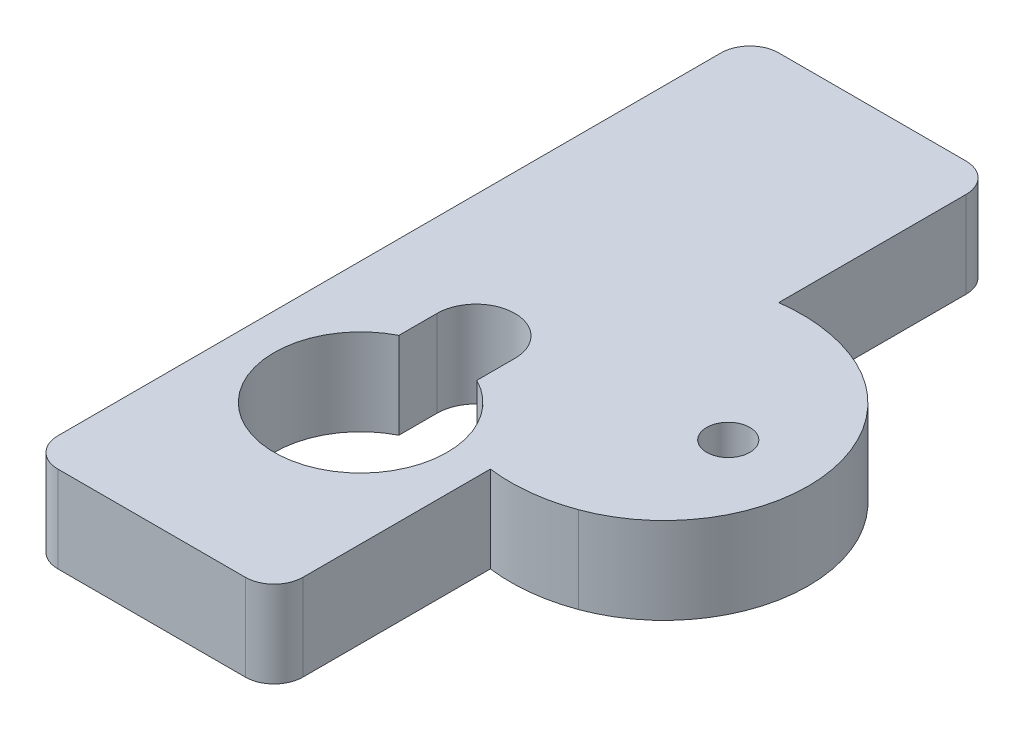
ISO-10303-21;
HEADER;
FILE_DESCRIPTION(('STEP AP214'),'2;1');
FILE_NAME('part.step','',(''),(''),'','','');
FILE_SCHEMA(('AUTOMOTIVE_DESIGN { 1 0 10303 214 1 1 1 1 }'));
ENDSEC;
DATA;
#1=APPLICATION_CONTEXT('core data for automotive mechanical design processes');
#2=APPLICATION_PROTOCOL_DEFINITION('international standard','automotive_design',2000,#1);
#3=PRODUCT_CONTEXT('',#1,'mechanical');
#4=PRODUCT('Part','Part','',(#3));
#5=PRODUCT_RELATED_PRODUCT_CATEGORY('part','',(#4));
#6=PRODUCT_DEFINITION_FORMATION('','',#4);
#7=PRODUCT_DEFINITION_CONTEXT('part definition',#1,'design');
#8=PRODUCT_DEFINITION('design','',#6,#7);
#9=PRODUCT_DEFINITION_SHAPE('','',#8);
#10=(LENGTH_UNIT() NAMED_UNIT(*) SI_UNIT(.MILLI.,.METRE.));
#11=(NAMED_UNIT(*) PLANE_ANGLE_UNIT() SI_UNIT($,.RADIAN.));
#12=(NAMED_UNIT(*) SI_UNIT($,.STERADIAN.) SOLID_ANGLE_UNIT());
#13=UNCERTAINTY_MEASURE_WITH_UNIT(LENGTH_MEASURE(1.E-05),#10,'distance_accuracy_value','');
#14=(GEOMETRIC_REPRESENTATION_CONTEXT(3) GLOBAL_UNCERTAINTY_ASSIGNED_CONTEXT((#13)) GLOBAL_UNIT_ASSIGNED_CONTEXT((#10,
#11,#12)) REPRESENTATION_CONTEXT('',''));
#15=CARTESIAN_POINT('',(0.,0.,0.));
#16=DIRECTION('',(0.,0.,1.));
#17=DIRECTION('',(1.,0.,0.));
#18=AXIS2_PLACEMENT_3D('',#15,#16,#17);
#19=CARTESIAN_POINT('',(5.79813436692227,6.,0.));
#20=DIRECTION('',(1.,0.,0.));
#21=DIRECTION('',(0.,0.,-1.));
#22=AXIS2_PLACEMENT_3D('',#19,#20,#21);
#23=PLANE('',#22);
#24=DIRECTION('',(0.,0.,1.));
#25=VECTOR('',#24,1.);
#26=CARTESIAN_POINT('',(5.79813436692227,0.,0.));
#27=LINE('',#26,#25);
#28=CARTESIAN_POINT('',(5.79813436692227,0.,-22.5));
#29=VERTEX_POINT('',#28);
#30=CARTESIAN_POINT('',(5.79813436692227,0.,-19.8572308239233));
#31=VERTEX_POINT('',#30);
#32=EDGE_CURVE('E225',#29,#31,#27,.T.);
#33=ORIENTED_EDGE('',*,*,#32,.F.);
#34=DIRECTION('',(0.,-1.,0.));
#35=VECTOR('',#34,1.);
#36=CARTESIAN_POINT('',(5.79813436692227,6.,-22.5));
#37=LINE('',#36,#35);
#38=CARTESIAN_POINT('',(5.79813436692227,6.,-22.5));
#39=VERTEX_POINT('',#38);
#40=EDGE_CURVE('E244',#39,#29,#37,.T.);
#41=ORIENTED_EDGE('',*,*,#40,.F.);
#42=DIRECTION('',(0.,0.,1.));
#43=VECTOR('',#42,1.);
#44=CARTESIAN_POINT('',(5.79813436692227,6.,0.));
#45=LINE('',#44,#43);
#46=CARTESIAN_POINT('',(5.79813436692227,6.,-19.8572308239233));
#47=VERTEX_POINT('',#46);
#48=EDGE_CURVE('E194',#39,#47,#45,.T.);
#49=ORIENTED_EDGE('',*,*,#48,.T.);
#50=DIRECTION('',(0.,-1.,0.));
#51=VECTOR('',#50,1.);
#52=CARTESIAN_POINT('',(5.79813436692227,6.,-19.8572308239233));
#53=LINE('',#52,#51);
#54=EDGE_CURVE('E172',#47,#31,#53,.T.);
#55=ORIENTED_EDGE('',*,*,#54,.T.);
#56=EDGE_LOOP('',(#33,#41,#49,#55));
#57=FACE_BOUND('',#56,.T.);
#58=ADVANCED_FACE('F41',(#57),#23,.T.);
#59=CARTESIAN_POINT('',(8.5,6.,-22.5));
#60=DIRECTION('',(0.,-1.,0.));
#61=DIRECTION('',(0.,0.,-1.));
#62=AXIS2_PLACEMENT_3D('',#59,#60,#61);
#63=CYLINDRICAL_SURFACE('',#62,2.70186563307773);
#64=CARTESIAN_POINT('',(8.5,0.,-22.5));
#65=DIRECTION('',(0.,1.,0.));
#66=DIRECTION('',(0.,0.,1.));
#67=AXIS2_PLACEMENT_3D('',#64,#65,#66);
#68=CIRCLE('',#67,2.70186563307773);
#69=CARTESIAN_POINT('',(11.2018656330777,0.,-22.5));
#70=VERTEX_POINT('',#69);
#71=EDGE_CURVE('E228',#70,#29,#68,.T.);
#72=ORIENTED_EDGE('',*,*,#71,.F.);
#73=DIRECTION('',(0.,-1.,0.));
#74=VECTOR('',#73,1.);
#75=CARTESIAN_POINT('',(11.2018656330777,6.,-22.5));
#76=LINE('',#75,#74);
#77=CARTESIAN_POINT('',(11.2018656330777,6.,-22.5));
#78=VERTEX_POINT('',#77);
#79=EDGE_CURVE('E242',#78,#70,#76,.T.);
#80=ORIENTED_EDGE('',*,*,#79,.F.);
#81=CARTESIAN_POINT('',(8.5,6.,-22.5));
#82=DIRECTION('',(0.,1.,0.));
#83=DIRECTION('',(0.,0.,1.));
#84=AXIS2_PLACEMENT_3D('',#81,#82,#83);
#85=CIRCLE('',#84,2.70186563307773);
#86=EDGE_CURVE('E197',#78,#39,#85,.T.);
#87=ORIENTED_EDGE('',*,*,#86,.T.);
#88=ORIENTED_EDGE('',*,*,#40,.T.);
#89=EDGE_LOOP('',(#72,#80,#87,#88));
#90=FACE_BOUND('',#89,.T.);
#91=ADVANCED_FACE('F330',(#90),#63,.F.);
#92=CARTESIAN_POINT('',(11.2018656330777,6.,0.));
#93=DIRECTION('',(1.,0.,0.));
#94=DIRECTION('',(0.,0.,-1.));
#95=AXIS2_PLACEMENT_3D('',#92,#93,#94);
#96=PLANE('',#95);
#97=DIRECTION('',(0.,0.,1.));
#98=VECTOR('',#97,1.);
#99=CARTESIAN_POINT('',(11.2018656330777,0.,0.));
#100=LINE('',#99,#98);
#101=CARTESIAN_POINT('',(11.2018656330777,0.,-19.8572308239233));
#102=VERTEX_POINT('',#101);
#103=EDGE_CURVE('E231',#70,#102,#100,.T.);
#104=ORIENTED_EDGE('',*,*,#103,.T.);
#105=DIRECTION('',(0.,-1.,0.));
#106=VECTOR('',#105,1.);
#107=CARTESIAN_POINT('',(11.2018656330777,6.,-19.8572308239233));
#108=LINE('',#107,#106);
#109=CARTESIAN_POINT('',(11.2018656330777,6.,-19.8572308239233));
#110=VERTEX_POINT('',#109);
#111=EDGE_CURVE('E240',#110,#102,#108,.T.);
#112=ORIENTED_EDGE('',*,*,#111,.F.);
#113=DIRECTION('',(0.,0.,1.));
#114=VECTOR('',#113,1.);
#115=CARTESIAN_POINT('',(11.2018656330777,6.,0.));
#116=LINE('',#115,#114);
#117=EDGE_CURVE('E200',#78,#110,#116,.T.);
#118=ORIENTED_EDGE('',*,*,#117,.F.);
#119=ORIENTED_EDGE('',*,*,#79,.T.);
#120=EDGE_LOOP('',(#104,#112,#118,#119));
#121=FACE_BOUND('',#120,.T.);
#122=ADVANCED_FACE('F336',(#121),#96,.F.);
#123=CARTESIAN_POINT('',(18.5,6.,-26.5));
#124=DIRECTION('',(0.,-1.,0.));
#125=DIRECTION('',(0.,0.,-1.));
#126=AXIS2_PLACEMENT_3D('',#123,#124,#125);
#127=CYLINDRICAL_SURFACE('',#126,11.5974135047432);
#128=CARTESIAN_POINT('',(18.5,0.,-26.5));
#129=DIRECTION('',(0.,1.,0.));
#130=DIRECTION('',(0.,0.,1.));
#131=AXIS2_PLACEMENT_3D('',#128,#129,#130);
#132=CIRCLE('',#131,11.5974135047432);
#133=CARTESIAN_POINT('',(22.487979972059,0.,-15.609820215329));
#134=VERTEX_POINT('',#133);
#135=CARTESIAN_POINT('',(17.,0.,-15.));
#136=VERTEX_POINT('',#135);
#137=EDGE_CURVE('E208',#134,#136,#132,.F.);
#138=ORIENTED_EDGE('',*,*,#137,.F.);
#139=DIRECTION('',(0.,-1.,0.));
#140=VECTOR('',#139,1.);
#141=CARTESIAN_POINT('',(22.487979972059,6.,-15.609820215329));
#142=LINE('',#141,#140);
#143=CARTESIAN_POINT('',(22.487979972059,6.,-15.609820215329));
#144=VERTEX_POINT('',#143);
#145=EDGE_CURVE('E49',#134,#144,#142,.F.);
#146=ORIENTED_EDGE('',*,*,#145,.T.);
#147=CARTESIAN_POINT('',(18.5,6.,-26.5));
#148=DIRECTION('',(0.,1.,0.));
#149=DIRECTION('',(0.,0.,1.));
#150=AXIS2_PLACEMENT_3D('',#147,#148,#149);
#151=CIRCLE('',#150,11.5974135047432);
#152=CARTESIAN_POINT('',(17.,6.,-15.));
#153=VERTEX_POINT('',#152);
#154=EDGE_CURVE('E178',#144,#153,#151,.F.);
#155=ORIENTED_EDGE('',*,*,#154,.T.);
#156=DIRECTION('',(0.,-1.,0.));
#157=VECTOR('',#156,1.);
#158=CARTESIAN_POINT('',(17.,6.,-15.));
#159=LINE('',#158,#157);
#160=EDGE_CURVE('E173',#153,#136,#159,.T.);
#161=ORIENTED_EDGE('',*,*,#160,.T.);
#162=EDGE_LOOP('',(#138,#146,#155,#161));
#163=FACE_BOUND('',#162,.T.);
#164=ADVANCED_FACE('F323',(#163),#127,.T.);
#165=CARTESIAN_POINT('',(18.5,6.,-23.5));
#166=DIRECTION('',(0.,-1.,0.));
#167=DIRECTION('',(0.,0.,-1.));
#168=AXIS2_PLACEMENT_3D('',#165,#166,#167);
#169=CYLINDRICAL_SURFACE('',#168,11.5974135047432);
#170=CARTESIAN_POINT('',(18.5,6.,-23.5));
#171=DIRECTION('',(0.,1.,0.));
#172=DIRECTION('',(0.,0.,1.));
#173=AXIS2_PLACEMENT_3D('',#170,#171,#172);
#174=CIRCLE('',#173,11.5974135047432);
#175=CARTESIAN_POINT('',(17.,6.,-35.));
#176=VERTEX_POINT('',#175);
#177=CARTESIAN_POINT('',(22.487979972059,6.,-34.390179784671));
#178=VERTEX_POINT('',#177);
#179=EDGE_CURVE('E164',#176,#178,#174,.F.);
#180=ORIENTED_EDGE('',*,*,#179,.T.);
#181=DIRECTION('',(0.,-1.,0.));
#182=VECTOR('',#181,1.);
#183=CARTESIAN_POINT('',(22.487979972059,6.,-34.390179784671));
#184=LINE('',#183,#182);
#185=CARTESIAN_POINT('',(22.487979972059,0.,-34.390179784671));
#186=VERTEX_POINT('',#185);
#187=EDGE_CURVE('E283',#178,#186,#184,.T.);
#188=ORIENTED_EDGE('',*,*,#187,.T.);
#189=CARTESIAN_POINT('',(18.5,0.,-23.5));
#190=DIRECTION('',(0.,1.,0.));
#191=DIRECTION('',(0.,0.,1.));
#192=AXIS2_PLACEMENT_3D('',#189,#190,#191);
#193=CIRCLE('',#192,11.5974135047432);
#194=CARTESIAN_POINT('',(17.,0.,-35.));
#195=VERTEX_POINT('',#194);
#196=EDGE_CURVE('E171',#195,#186,#193,.F.);
#197=ORIENTED_EDGE('',*,*,#196,.F.);
#198=DIRECTION('',(0.,-1.,0.));
#199=VECTOR('',#198,1.);
#200=CARTESIAN_POINT('',(17.,6.,-35.));
#201=LINE('',#200,#199);
#202=EDGE_CURVE('E156',#176,#195,#201,.T.);
#203=ORIENTED_EDGE('',*,*,#202,.F.);
#204=EDGE_LOOP('',(#180,#188,#197,#203));
#205=FACE_BOUND('',#204,.T.);
#206=ADVANCED_FACE('F168',(#205),#169,.T.);
#207=CARTESIAN_POINT('',(17.,6.,0.));
#208=DIRECTION('',(1.,0.,0.));
#209=DIRECTION('',(0.,0.,-1.));
#210=AXIS2_PLACEMENT_3D('',#207,#208,#209);
#211=PLANE('',#210);
#212=DIRECTION('',(0.,0.,1.));
#213=VECTOR('',#212,1.);
#214=CARTESIAN_POINT('',(17.,0.,0.));
#215=LINE('',#214,#213);
#216=CARTESIAN_POINT('',(17.,0.,-48.));
#217=VERTEX_POINT('',#216);
#218=EDGE_CURVE('E211',#217,#195,#215,.T.);
#219=ORIENTED_EDGE('',*,*,#218,.F.);
#220=DIRECTION('',(0.,-1.,0.));
#221=VECTOR('',#220,1.);
#222=CARTESIAN_POINT('',(17.,6.,-48.));
#223=LINE('',#222,#221);
#224=CARTESIAN_POINT('',(17.,6.,-48.));
#225=VERTEX_POINT('',#224);
#226=EDGE_CURVE('E159',#217,#225,#223,.F.);
#227=ORIENTED_EDGE('',*,*,#226,.T.);
#228=DIRECTION('',(0.,0.,1.));
#229=VECTOR('',#228,1.);
#230=CARTESIAN_POINT('',(17.,6.,0.));
#231=LINE('',#230,#229);
#232=EDGE_CURVE('E152',#225,#176,#231,.T.);
#233=ORIENTED_EDGE('',*,*,#232,.T.);
#234=ORIENTED_EDGE('',*,*,#202,.T.);
#235=EDGE_LOOP('',(#219,#227,#233,#234));
#236=FACE_BOUND('',#235,.T.);
#237=ADVANCED_FACE('F155',(#236),#211,.T.);
#238=CARTESIAN_POINT('',(0.,6.,-50.));
#239=DIRECTION('',(0.,0.,-1.));
#240=DIRECTION('',(-1.,0.,0.));
#241=AXIS2_PLACEMENT_3D('',#238,#239,#240);
#242=PLANE('',#241);
#243=DIRECTION('',(1.,0.,0.));
#244=VECTOR('',#243,1.);
#245=CARTESIAN_POINT('',(0.,0.,-50.));
#246=LINE('',#245,#244);
#247=CARTESIAN_POINT('',(2.,0.,-50.));
#248=VERTEX_POINT('',#247);
#249=CARTESIAN_POINT('',(15.,0.,-50.));
#250=VERTEX_POINT('',#249);
#251=EDGE_CURVE('E213',#248,#250,#246,.T.);
#252=ORIENTED_EDGE('',*,*,#251,.F.);
#253=DIRECTION('',(0.,-1.,0.));
#254=VECTOR('',#253,1.);
#255=CARTESIAN_POINT('',(2.,6.,-50.));
#256=LINE('',#255,#254);
#257=CARTESIAN_POINT('',(2.,6.,-50.));
#258=VERTEX_POINT('',#257);
#259=EDGE_CURVE('E264',#248,#258,#256,.F.);
#260=ORIENTED_EDGE('',*,*,#259,.T.);
#261=DIRECTION('',(1.,0.,0.));
#262=VECTOR('',#261,1.);
#263=CARTESIAN_POINT('',(0.,6.,-50.));
#264=LINE('',#263,#262);
#265=CARTESIAN_POINT('',(15.,6.,-50.));
#266=VERTEX_POINT('',#265);
#267=EDGE_CURVE('E163',#258,#266,#264,.T.);
#268=ORIENTED_EDGE('',*,*,#267,.T.);
#269=DIRECTION('',(0.,-1.,0.));
#270=VECTOR('',#269,1.);
#271=CARTESIAN_POINT('',(15.,6.,-50.));
#272=LINE('',#271,#270);
#273=EDGE_CURVE('E261',#266,#250,#272,.T.);
#274=ORIENTED_EDGE('',*,*,#273,.T.);
#275=EDGE_LOOP('',(#252,#260,#268,#274));
#276=FACE_BOUND('',#275,.T.);
#277=ADVANCED_FACE('F295',(#276),#242,.T.);
#278=CARTESIAN_POINT('',(0.,6.,0.));
#279=DIRECTION('',(-1.,0.,0.));
#280=DIRECTION('',(0.,0.,1.));
#281=AXIS2_PLACEMENT_3D('',#278,#279,#280);
#282=PLANE('',#281);
#283=DIRECTION('',(0.,0.,-1.));
#284=VECTOR('',#283,1.);
#285=CARTESIAN_POINT('',(0.,6.,0.));
#286=LINE('',#285,#284);
#287=CARTESIAN_POINT('',(0.,6.,-2.));
#288=VERTEX_POINT('',#287);
#289=CARTESIAN_POINT('',(0.,6.,-48.));
#290=VERTEX_POINT('',#289);
#291=EDGE_CURVE('E185',#288,#290,#286,.T.);
#292=ORIENTED_EDGE('',*,*,#291,.T.);
#293=DIRECTION('',(0.,-1.,0.));
#294=VECTOR('',#293,1.);
#295=CARTESIAN_POINT('',(0.,6.,-48.));
#296=LINE('',#295,#294);
#297=CARTESIAN_POINT('',(0.,0.,-48.));
#298=VERTEX_POINT('',#297);
#299=EDGE_CURVE('E250',#290,#298,#296,.T.);
#300=ORIENTED_EDGE('',*,*,#299,.T.);
#301=DIRECTION('',(0.,0.,-1.));
#302=VECTOR('',#301,1.);
#303=CARTESIAN_POINT('',(0.,0.,0.));
#304=LINE('',#303,#302);
#305=CARTESIAN_POINT('',(0.,0.,-2.));
#306=VERTEX_POINT('',#305);
#307=EDGE_CURVE('E216',#306,#298,#304,.T.);
#308=ORIENTED_EDGE('',*,*,#307,.F.);
#309=DIRECTION('',(0.,-1.,0.));
#310=VECTOR('',#309,1.);
#311=CARTESIAN_POINT('',(0.,6.,-2.));
#312=LINE('',#311,#310);
#313=EDGE_CURVE('E246',#306,#288,#312,.F.);
#314=ORIENTED_EDGE('',*,*,#313,.T.);
#315=EDGE_LOOP('',(#292,#300,#308,#314));
#316=FACE_BOUND('',#315,.T.);
#317=ADVANCED_FACE('F303',(#316),#282,.T.);
#318=CARTESIAN_POINT('',(0.,6.,0.));
#319=DIRECTION('',(0.,0.,1.));
#320=DIRECTION('',(1.,0.,0.));
#321=AXIS2_PLACEMENT_3D('',#318,#319,#320);
#322=PLANE('',#321);
#323=DIRECTION('',(-1.,0.,0.));
#324=VECTOR('',#323,1.);
#325=CARTESIAN_POINT('',(0.,6.,0.));
#326=LINE('',#325,#324);
#327=CARTESIAN_POINT('',(15.,6.,0.));
#328=VERTEX_POINT('',#327);
#329=CARTESIAN_POINT('',(2.,6.,0.));
#330=VERTEX_POINT('',#329);
#331=EDGE_CURVE('E188',#328,#330,#326,.T.);
#332=ORIENTED_EDGE('',*,*,#331,.T.);
#333=DIRECTION('',(0.,-1.,0.));
#334=VECTOR('',#333,1.);
#335=CARTESIAN_POINT('',(2.,6.,0.));
#336=LINE('',#335,#334);
#337=CARTESIAN_POINT('',(2.,0.,0.));
#338=VERTEX_POINT('',#337);
#339=EDGE_CURVE('E277',#330,#338,#336,.T.);
#340=ORIENTED_EDGE('',*,*,#339,.T.);
#341=DIRECTION('',(-1.,0.,0.));
#342=VECTOR('',#341,1.);
#343=CARTESIAN_POINT('',(0.,0.,0.));
#344=LINE('',#343,#342);
#345=CARTESIAN_POINT('',(15.,0.,0.));
#346=VERTEX_POINT('',#345);
#347=EDGE_CURVE('E219',#346,#338,#344,.T.);
#348=ORIENTED_EDGE('',*,*,#347,.F.);
#349=DIRECTION('',(0.,-1.,0.));
#350=VECTOR('',#349,1.);
#351=CARTESIAN_POINT('',(15.,6.,0.));
#352=LINE('',#351,#350);
#353=EDGE_CURVE('E275',#346,#328,#352,.F.);
#354=ORIENTED_EDGE('',*,*,#353,.T.);
#355=EDGE_LOOP('',(#332,#340,#348,#354));
#356=FACE_BOUND('',#355,.T.);
#357=ADVANCED_FACE('F312',(#356),#322,.T.);
#358=CARTESIAN_POINT('',(8.5,6.,-14.5));
#359=DIRECTION('',(0.,-1.,0.));
#360=DIRECTION('',(0.,0.,-1.));
#361=AXIS2_PLACEMENT_3D('',#358,#359,#360);
#362=CYLINDRICAL_SURFACE('',#361,6.);
#363=CARTESIAN_POINT('',(8.5,0.,-14.5));
#364=DIRECTION('',(0.,1.,0.));
#365=DIRECTION('',(0.,0.,1.));
#366=AXIS2_PLACEMENT_3D('',#363,#364,#365);
#367=CIRCLE('',#366,6.);
#368=EDGE_CURVE('E234',#31,#102,#367,.T.);
#369=ORIENTED_EDGE('',*,*,#368,.F.);
#370=ORIENTED_EDGE('',*,*,#54,.F.);
#371=CARTESIAN_POINT('',(8.5,6.,-14.5));
#372=DIRECTION('',(0.,1.,0.));
#373=DIRECTION('',(0.,0.,1.));
#374=AXIS2_PLACEMENT_3D('',#371,#372,#373);
#375=CIRCLE('',#374,6.);
#376=EDGE_CURVE('E202',#47,#110,#375,.T.);
#377=ORIENTED_EDGE('',*,*,#376,.T.);
#378=ORIENTED_EDGE('',*,*,#111,.T.);
#379=EDGE_LOOP('',(#369,#370,#377,#378));
#380=FACE_BOUND('',#379,.T.);
#381=ADVANCED_FACE('F345',(#380),#362,.F.);
#382=CARTESIAN_POINT('',(17.,6.,0.));
#383=DIRECTION('',(1.,0.,0.));
#384=DIRECTION('',(0.,0.,-1.));
#385=AXIS2_PLACEMENT_3D('',#382,#383,#384);
#386=PLANE('',#385);
#387=DIRECTION('',(0.,0.,1.));
#388=VECTOR('',#387,1.);
#389=CARTESIAN_POINT('',(17.,6.,0.));
#390=LINE('',#389,#388);
#391=CARTESIAN_POINT('',(17.,6.,-2.));
#392=VERTEX_POINT('',#391);
#393=EDGE_CURVE('E191',#153,#392,#390,.T.);
#394=ORIENTED_EDGE('',*,*,#393,.T.);
#395=DIRECTION('',(0.,-1.,0.));
#396=VECTOR('',#395,1.);
#397=CARTESIAN_POINT('',(17.,6.,-2.));
#398=LINE('',#397,#396);
#399=CARTESIAN_POINT('',(17.,0.,-2.));
#400=VERTEX_POINT('',#399);
#401=EDGE_CURVE('E280',#392,#400,#398,.T.);
#402=ORIENTED_EDGE('',*,*,#401,.T.);
#403=DIRECTION('',(0.,0.,1.));
#404=VECTOR('',#403,1.);
#405=CARTESIAN_POINT('',(17.,0.,0.));
#406=LINE('',#405,#404);
#407=EDGE_CURVE('E222',#136,#400,#406,.T.);
#408=ORIENTED_EDGE('',*,*,#407,.F.);
#409=ORIENTED_EDGE('',*,*,#160,.F.);
#410=EDGE_LOOP('',(#394,#402,#408,#409));
#411=FACE_BOUND('',#410,.T.);
#412=ADVANCED_FACE('F321',(#411),#386,.T.);
#413=CARTESIAN_POINT('',(23.5,6.,-25.));
#414=DIRECTION('',(0.,-1.,0.));
#415=DIRECTION('',(0.,0.,-1.));
#416=AXIS2_PLACEMENT_3D('',#413,#414,#415);
#417=CYLINDRICAL_SURFACE('',#416,1.5);
#418=CARTESIAN_POINT('',(23.5,6.,-25.));
#419=DIRECTION('',(0.,1.,0.));
#420=DIRECTION('',(0.,0.,1.));
#421=AXIS2_PLACEMENT_3D('',#418,#419,#420);
#422=CIRCLE('',#421,1.5);
#423=CARTESIAN_POINT('',(23.5,6.,-23.5));
#424=VERTEX_POINT('',#423);
#425=EDGE_CURVE('E205',#424,#424,#422,.T.);
#426=ORIENTED_EDGE('',*,*,#425,.T.);
#427=EDGE_LOOP('',(#426));
#428=FACE_BOUND('',#427,.T.);
#429=CARTESIAN_POINT('',(23.5,0.,-25.));
#430=DIRECTION('',(0.,1.,0.));
#431=DIRECTION('',(0.,0.,1.));
#432=AXIS2_PLACEMENT_3D('',#429,#430,#431);
#433=CIRCLE('',#432,1.5);
#434=CARTESIAN_POINT('',(23.5,0.,-23.5));
#435=VERTEX_POINT('',#434);
#436=EDGE_CURVE('E180',#435,#435,#433,.T.);
#437=ORIENTED_EDGE('',*,*,#436,.F.);
#438=EDGE_LOOP('',(#437));
#439=FACE_BOUND('',#438,.T.);
#440=ADVANCED_FACE('F344',(#428,#439),#417,.F.);
#441=CARTESIAN_POINT('',(0.,6.,0.));
#442=DIRECTION('',(0.,1.,0.));
#443=DIRECTION('',(0.,0.,1.));
#444=AXIS2_PLACEMENT_3D('',#441,#442,#443);
#445=PLANE('',#444);
#446=ORIENTED_EDGE('',*,*,#154,.F.);
#447=CARTESIAN_POINT('',(19.0492994676276,6.,-25.));
#448=DIRECTION('',(0.,1.,0.));
#449=DIRECTION('',(0.,0.,1.));
#450=AXIS2_PLACEMENT_3D('',#447,#448,#449);
#451=CIRCLE('',#450,10.);
#452=EDGE_CURVE('E11',#144,#178,#451,.T.);
#453=ORIENTED_EDGE('',*,*,#452,.T.);
#454=ORIENTED_EDGE('',*,*,#179,.F.);
#455=ORIENTED_EDGE('',*,*,#232,.F.);
#456=CARTESIAN_POINT('',(15.,6.,-48.));
#457=DIRECTION('',(0.,1.,0.));
#458=DIRECTION('',(0.,0.,1.));
#459=AXIS2_PLACEMENT_3D('',#456,#457,#458);
#460=CIRCLE('',#459,2.);
#461=EDGE_CURVE('E270',#225,#266,#460,.T.);
#462=ORIENTED_EDGE('',*,*,#461,.T.);
#463=ORIENTED_EDGE('',*,*,#267,.F.);
#464=CARTESIAN_POINT('',(2.,6.,-48.));
#465=DIRECTION('',(0.,1.,0.));
#466=DIRECTION('',(0.,0.,1.));
#467=AXIS2_PLACEMENT_3D('',#464,#465,#466);
#468=CIRCLE('',#467,2.);
#469=EDGE_CURVE('E272',#258,#290,#468,.T.);
#470=ORIENTED_EDGE('',*,*,#469,.T.);
#471=ORIENTED_EDGE('',*,*,#291,.F.);
#472=CARTESIAN_POINT('',(2.,6.,-2.));
#473=DIRECTION('',(0.,1.,0.));
#474=DIRECTION('',(0.,0.,1.));
#475=AXIS2_PLACEMENT_3D('',#472,#473,#474);
#476=CIRCLE('',#475,2.);
#477=EDGE_CURVE('E268',#288,#330,#476,.T.);
#478=ORIENTED_EDGE('',*,*,#477,.T.);
#479=ORIENTED_EDGE('',*,*,#331,.F.);
#480=CARTESIAN_POINT('',(15.,6.,-2.));
#481=DIRECTION('',(0.,1.,0.));
#482=DIRECTION('',(0.,0.,1.));
#483=AXIS2_PLACEMENT_3D('',#480,#481,#482);
#484=CIRCLE('',#483,2.);
#485=EDGE_CURVE('E266',#328,#392,#484,.T.);
#486=ORIENTED_EDGE('',*,*,#485,.T.);
#487=ORIENTED_EDGE('',*,*,#393,.F.);
#488=EDGE_LOOP('',(#446,#453,#454,#455,#462,#463,#470,#471,#478,#479,#486,#487));
#489=FACE_BOUND('',#488,.T.);
#490=ORIENTED_EDGE('',*,*,#48,.F.);
#491=ORIENTED_EDGE('',*,*,#86,.F.);
#492=ORIENTED_EDGE('',*,*,#117,.T.);
#493=ORIENTED_EDGE('',*,*,#376,.F.);
#494=EDGE_LOOP('',(#490,#491,#492,#493));
#495=FACE_BOUND('',#494,.T.);
#496=ORIENTED_EDGE('',*,*,#425,.F.);
#497=EDGE_LOOP('',(#496));
#498=FACE_BOUND('',#497,.T.);
#499=ADVANCED_FACE('F175',(#489,#495,#498),#445,.T.);
#500=CARTESIAN_POINT('',(0.,0.,0.));
#501=DIRECTION('',(0.,1.,0.));
#502=DIRECTION('',(0.,0.,1.));
#503=AXIS2_PLACEMENT_3D('',#500,#501,#502);
#504=PLANE('',#503);
#505=ORIENTED_EDGE('',*,*,#196,.T.);
#506=CARTESIAN_POINT('',(19.0492994676276,0.,-25.));
#507=DIRECTION('',(0.,1.,0.));
#508=DIRECTION('',(0.,0.,1.));
#509=AXIS2_PLACEMENT_3D('',#506,#507,#508);
#510=CIRCLE('',#509,10.);
#511=EDGE_CURVE('E63',#186,#134,#510,.F.);
#512=ORIENTED_EDGE('',*,*,#511,.T.);
#513=ORIENTED_EDGE('',*,*,#137,.T.);
#514=ORIENTED_EDGE('',*,*,#407,.T.);
#515=CARTESIAN_POINT('',(15.,0.,-2.));
#516=DIRECTION('',(0.,1.,0.));
#517=DIRECTION('',(0.,0.,1.));
#518=AXIS2_PLACEMENT_3D('',#515,#516,#517);
#519=CIRCLE('',#518,2.);
#520=EDGE_CURVE('E253',#400,#346,#519,.F.);
#521=ORIENTED_EDGE('',*,*,#520,.T.);
#522=ORIENTED_EDGE('',*,*,#347,.T.);
#523=CARTESIAN_POINT('',(2.,0.,-2.));
#524=DIRECTION('',(0.,1.,0.));
#525=DIRECTION('',(0.,0.,1.));
#526=AXIS2_PLACEMENT_3D('',#523,#524,#525);
#527=CIRCLE('',#526,2.);
#528=EDGE_CURVE('E255',#338,#306,#527,.F.);
#529=ORIENTED_EDGE('',*,*,#528,.T.);
#530=ORIENTED_EDGE('',*,*,#307,.T.);
#531=CARTESIAN_POINT('',(2.,0.,-48.));
#532=DIRECTION('',(0.,1.,0.));
#533=DIRECTION('',(0.,0.,1.));
#534=AXIS2_PLACEMENT_3D('',#531,#532,#533);
#535=CIRCLE('',#534,2.);
#536=EDGE_CURVE('E259',#298,#248,#535,.F.);
#537=ORIENTED_EDGE('',*,*,#536,.T.);
#538=ORIENTED_EDGE('',*,*,#251,.T.);
#539=CARTESIAN_POINT('',(15.,0.,-48.));
#540=DIRECTION('',(0.,1.,0.));
#541=DIRECTION('',(0.,0.,1.));
#542=AXIS2_PLACEMENT_3D('',#539,#540,#541);
#543=CIRCLE('',#542,2.);
#544=EDGE_CURVE('E257',#250,#217,#543,.F.);
#545=ORIENTED_EDGE('',*,*,#544,.T.);
#546=ORIENTED_EDGE('',*,*,#218,.T.);
#547=EDGE_LOOP('',(#505,#512,#513,#514,#521,#522,#529,#530,#537,#538,#545,#546));
#548=FACE_BOUND('',#547,.T.);
#549=ORIENTED_EDGE('',*,*,#32,.T.);
#550=ORIENTED_EDGE('',*,*,#368,.T.);
#551=ORIENTED_EDGE('',*,*,#103,.F.);
#552=ORIENTED_EDGE('',*,*,#71,.T.);
#553=EDGE_LOOP('',(#549,#550,#551,#552));
#554=FACE_BOUND('',#553,.T.);
#555=ORIENTED_EDGE('',*,*,#436,.T.);
#556=EDGE_LOOP('',(#555));
#557=FACE_BOUND('',#556,.T.);
#558=ADVANCED_FACE('F286',(#548,#554,#557),#504,.F.);
#559=CARTESIAN_POINT('',(2.,6.,-48.));
#560=DIRECTION('',(0.,-1.,0.));
#561=DIRECTION('',(0.,0.,-1.));
#562=AXIS2_PLACEMENT_3D('',#559,#560,#561);
#563=CYLINDRICAL_SURFACE('',#562,2.);
#564=ORIENTED_EDGE('',*,*,#469,.F.);
#565=ORIENTED_EDGE('',*,*,#259,.F.);
#566=ORIENTED_EDGE('',*,*,#536,.F.);
#567=ORIENTED_EDGE('',*,*,#299,.F.);
#568=EDGE_LOOP('',(#564,#565,#566,#567));
#569=FACE_BOUND('',#568,.T.);
#570=ADVANCED_FACE('F298',(#569),#563,.T.);
#571=CARTESIAN_POINT('',(15.,6.,-48.));
#572=DIRECTION('',(0.,-1.,0.));
#573=DIRECTION('',(0.,0.,-1.));
#574=AXIS2_PLACEMENT_3D('',#571,#572,#573);
#575=CYLINDRICAL_SURFACE('',#574,2.);
#576=ORIENTED_EDGE('',*,*,#461,.F.);
#577=ORIENTED_EDGE('',*,*,#226,.F.);
#578=ORIENTED_EDGE('',*,*,#544,.F.);
#579=ORIENTED_EDGE('',*,*,#273,.F.);
#580=EDGE_LOOP('',(#576,#577,#578,#579));
#581=FACE_BOUND('',#580,.T.);
#582=ADVANCED_FACE('F289',(#581),#575,.T.);
#583=CARTESIAN_POINT('',(2.,6.,-2.));
#584=DIRECTION('',(0.,-1.,0.));
#585=DIRECTION('',(0.,0.,-1.));
#586=AXIS2_PLACEMENT_3D('',#583,#584,#585);
#587=CYLINDRICAL_SURFACE('',#586,2.);
#588=ORIENTED_EDGE('',*,*,#477,.F.);
#589=ORIENTED_EDGE('',*,*,#313,.F.);
#590=ORIENTED_EDGE('',*,*,#528,.F.);
#591=ORIENTED_EDGE('',*,*,#339,.F.);
#592=EDGE_LOOP('',(#588,#589,#590,#591));
#593=FACE_BOUND('',#592,.T.);
#594=ADVANCED_FACE('F307',(#593),#587,.T.);
#595=CARTESIAN_POINT('',(15.,6.,-2.));
#596=DIRECTION('',(0.,-1.,0.));
#597=DIRECTION('',(0.,0.,-1.));
#598=AXIS2_PLACEMENT_3D('',#595,#596,#597);
#599=CYLINDRICAL_SURFACE('',#598,2.);
#600=ORIENTED_EDGE('',*,*,#485,.F.);
#601=ORIENTED_EDGE('',*,*,#353,.F.);
#602=ORIENTED_EDGE('',*,*,#520,.F.);
#603=ORIENTED_EDGE('',*,*,#401,.F.);
#604=EDGE_LOOP('',(#600,#601,#602,#603));
#605=FACE_BOUND('',#604,.T.);
#606=ADVANCED_FACE('F316',(#605),#599,.T.);
#607=CARTESIAN_POINT('',(19.0492994676276,6.,-25.));
#608=DIRECTION('',(0.,-1.,0.));
#609=DIRECTION('',(0.,0.,-1.));
#610=AXIS2_PLACEMENT_3D('',#607,#608,#609);
#611=CYLINDRICAL_SURFACE('',#610,10.);
#612=ORIENTED_EDGE('',*,*,#452,.F.);
#613=ORIENTED_EDGE('',*,*,#145,.F.);
#614=ORIENTED_EDGE('',*,*,#511,.F.);
#615=ORIENTED_EDGE('',*,*,#187,.F.);
#616=EDGE_LOOP('',(#612,#613,#614,#615));
#617=FACE_BOUND('',#616,.T.);
#618=ADVANCED_FACE('F43',(#617),#611,.T.);
#619=CLOSED_SHELL('',(#58,#91,#122,#164,#206,#237,#277,#317,#357,#381,#412,#440,#499,#558,#570,
#582,#594,#606,#618));
#620=MANIFOLD_SOLID_BREP('B2',#619);
#621=ADVANCED_BREP_SHAPE_REPRESENTATION('',(#18,#620),#14);
#622=SHAPE_DEFINITION_REPRESENTATION(#9,#621);
ENDSEC;
END-ISO-10303-21;
